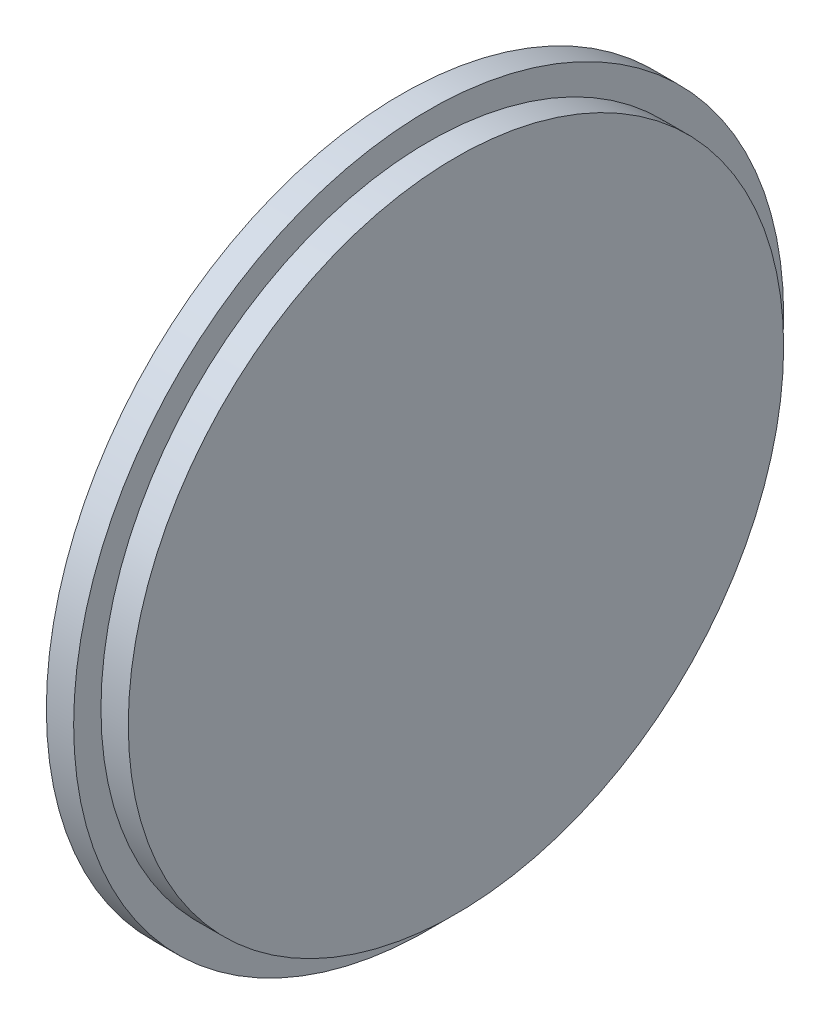
ISO-10303-21;
HEADER;
FILE_DESCRIPTION(('STEP AP214'),'2;1');
FILE_NAME('part.step','',(''),(''),'','','');
FILE_SCHEMA(('AUTOMOTIVE_DESIGN { 1 0 10303 214 1 1 1 1 }'));
ENDSEC;
DATA;
#1=APPLICATION_CONTEXT('core data for automotive mechanical design processes');
#2=APPLICATION_PROTOCOL_DEFINITION('international standard','automotive_design',2000,#1);
#3=PRODUCT_CONTEXT('',#1,'mechanical');
#4=PRODUCT('Part','Part','',(#3));
#5=PRODUCT_RELATED_PRODUCT_CATEGORY('part','',(#4));
#6=PRODUCT_DEFINITION_FORMATION('','',#4);
#7=PRODUCT_DEFINITION_CONTEXT('part definition',#1,'design');
#8=PRODUCT_DEFINITION('design','',#6,#7);
#9=PRODUCT_DEFINITION_SHAPE('','',#8);
#10=(LENGTH_UNIT() NAMED_UNIT(*) SI_UNIT(.MILLI.,.METRE.));
#11=(NAMED_UNIT(*) PLANE_ANGLE_UNIT() SI_UNIT($,.RADIAN.));
#12=(NAMED_UNIT(*) SI_UNIT($,.STERADIAN.) SOLID_ANGLE_UNIT());
#13=UNCERTAINTY_MEASURE_WITH_UNIT(LENGTH_MEASURE(1.E-05),#10,'distance_accuracy_value','');
#14=(GEOMETRIC_REPRESENTATION_CONTEXT(3) GLOBAL_UNCERTAINTY_ASSIGNED_CONTEXT((#13)) GLOBAL_UNIT_ASSIGNED_CONTEXT((#10,
#11,#12)) REPRESENTATION_CONTEXT('',''));
#15=CARTESIAN_POINT('',(0.,0.,0.));
#16=DIRECTION('',(0.,0.,1.));
#17=DIRECTION('',(1.,0.,0.));
#18=AXIS2_PLACEMENT_3D('',#15,#16,#17);
#19=CARTESIAN_POINT('',(3.175,0.,0.));
#20=DIRECTION('',(-1.,0.,0.));
#21=DIRECTION('',(0.,0.,1.));
#22=AXIS2_PLACEMENT_3D('',#19,#20,#21);
#23=CYLINDRICAL_SURFACE('',#22,38.1);
#24=CARTESIAN_POINT('',(3.175,0.,0.));
#25=DIRECTION('',(1.,0.,0.));
#26=DIRECTION('',(0.,0.,-1.));
#27=AXIS2_PLACEMENT_3D('',#24,#25,#26);
#28=CIRCLE('',#27,38.1);
#29=CARTESIAN_POINT('',(3.175,0.,-38.1));
#30=VERTEX_POINT('',#29);
#31=EDGE_CURVE('E10',#30,#30,#28,.T.);
#32=ORIENTED_EDGE('',*,*,#31,.F.);
#33=EDGE_LOOP('',(#32));
#34=FACE_BOUND('',#33,.T.);
#35=CARTESIAN_POINT('',(0.,0.,0.));
#36=DIRECTION('',(1.,0.,0.));
#37=DIRECTION('',(0.,0.,-1.));
#38=AXIS2_PLACEMENT_3D('',#35,#36,#37);
#39=CIRCLE('',#38,38.1);
#40=CARTESIAN_POINT('',(0.,0.,-38.1));
#41=VERTEX_POINT('',#40);
#42=EDGE_CURVE('E42',#41,#41,#39,.T.);
#43=ORIENTED_EDGE('',*,*,#42,.T.);
#44=EDGE_LOOP('',(#43));
#45=FACE_BOUND('',#44,.T.);
#46=ADVANCED_FACE('F39',(#34,#45),#23,.T.);
#47=CARTESIAN_POINT('',(3.175,0.,0.));
#48=DIRECTION('',(1.,0.,0.));
#49=DIRECTION('',(0.,0.,-1.));
#50=AXIS2_PLACEMENT_3D('',#47,#48,#49);
#51=PLANE('',#50);
#52=ORIENTED_EDGE('',*,*,#31,.T.);
#53=EDGE_LOOP('',(#52));
#54=FACE_BOUND('',#53,.T.);
#55=ADVANCED_FACE('F66',(#54),#51,.T.);
#56=CARTESIAN_POINT('',(-3.175,0.,0.));
#57=DIRECTION('',(1.,0.,0.));
#58=DIRECTION('',(0.,0.,-1.));
#59=AXIS2_PLACEMENT_3D('',#56,#57,#58);
#60=CYLINDRICAL_SURFACE('',#59,41.275);
#61=CARTESIAN_POINT('',(-3.175,0.,0.));
#62=DIRECTION('',(-1.,0.,0.));
#63=DIRECTION('',(0.,0.,1.));
#64=AXIS2_PLACEMENT_3D('',#61,#62,#63);
#65=CIRCLE('',#64,41.275);
#66=CARTESIAN_POINT('',(-3.175,0.,41.275));
#67=VERTEX_POINT('',#66);
#68=EDGE_CURVE('E51',#67,#67,#65,.T.);
#69=ORIENTED_EDGE('',*,*,#68,.F.);
#70=EDGE_LOOP('',(#69));
#71=FACE_BOUND('',#70,.T.);
#72=CARTESIAN_POINT('',(0.,0.,0.));
#73=DIRECTION('',(-1.,0.,0.));
#74=DIRECTION('',(0.,0.,1.));
#75=AXIS2_PLACEMENT_3D('',#72,#73,#74);
#76=CIRCLE('',#75,41.275);
#77=CARTESIAN_POINT('',(0.,0.,41.275));
#78=VERTEX_POINT('',#77);
#79=EDGE_CURVE('E53',#78,#78,#76,.T.);
#80=ORIENTED_EDGE('',*,*,#79,.T.);
#81=EDGE_LOOP('',(#80));
#82=FACE_BOUND('',#81,.T.);
#83=ADVANCED_FACE('F63',(#71,#82),#60,.T.);
#84=CARTESIAN_POINT('',(-3.175,0.,0.));
#85=DIRECTION('',(-1.,0.,0.));
#86=DIRECTION('',(0.,0.,1.));
#87=AXIS2_PLACEMENT_3D('',#84,#85,#86);
#88=PLANE('',#87);
#89=ORIENTED_EDGE('',*,*,#68,.T.);
#90=EDGE_LOOP('',(#89));
#91=FACE_BOUND('',#90,.T.);
#92=ADVANCED_FACE('F61',(#91),#88,.T.);
#93=CARTESIAN_POINT('',(0.,0.,0.));
#94=DIRECTION('',(-1.,0.,0.));
#95=DIRECTION('',(0.,0.,1.));
#96=AXIS2_PLACEMENT_3D('',#93,#94,#95);
#97=PLANE('',#96);
#98=ORIENTED_EDGE('',*,*,#42,.F.);
#99=EDGE_LOOP('',(#98));
#100=FACE_BOUND('',#99,.T.);
#101=ORIENTED_EDGE('',*,*,#79,.F.);
#102=EDGE_LOOP('',(#101));
#103=FACE_BOUND('',#102,.T.);
#104=ADVANCED_FACE('F70',(#100,#103),#97,.F.);
#105=CLOSED_SHELL('',(#46,#55,#83,#92,#104));
#106=MANIFOLD_SOLID_BREP('B2',#105);
#107=ADVANCED_BREP_SHAPE_REPRESENTATION('',(#18,#106),#14);
#108=SHAPE_DEFINITION_REPRESENTATION(#9,#107);
ENDSEC;
END-ISO-10303-21;
